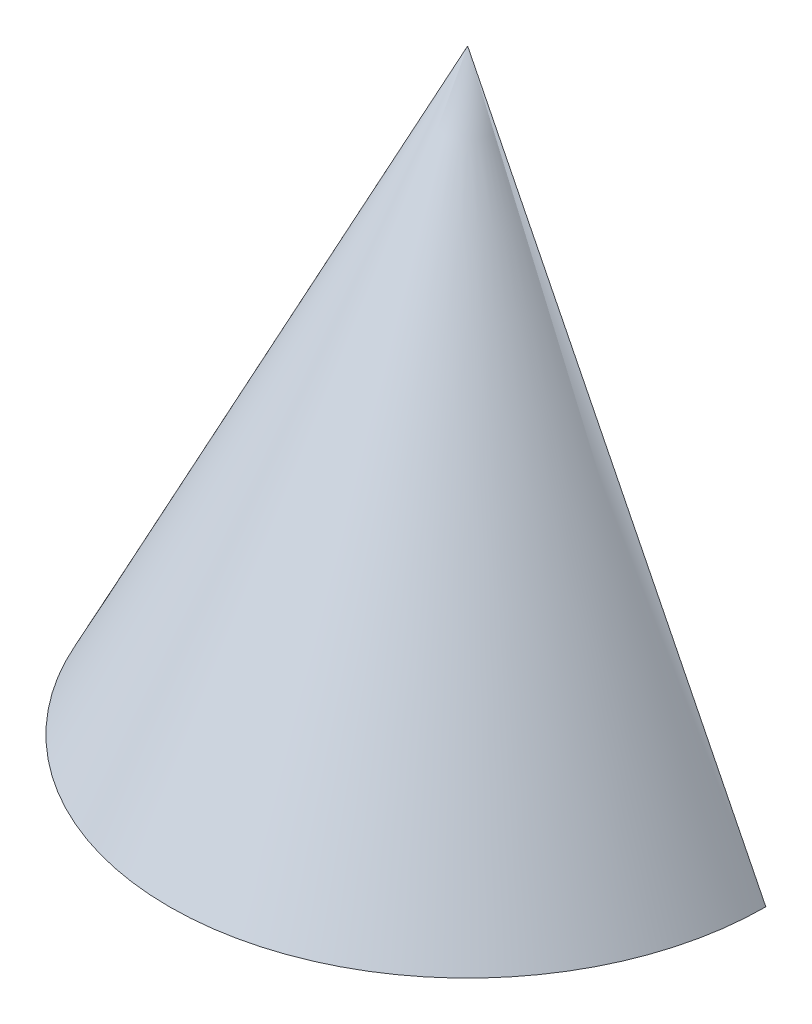
ISO-10303-21;
HEADER;
FILE_DESCRIPTION(('STEP AP214'),'2;1');
FILE_NAME('part.step','',(''),(''),'','','');
FILE_SCHEMA(('AUTOMOTIVE_DESIGN { 1 0 10303 214 1 1 1 1 }'));
ENDSEC;
DATA;
#1=APPLICATION_CONTEXT('core data for automotive mechanical design processes');
#2=APPLICATION_PROTOCOL_DEFINITION('international standard','automotive_design',2000,#1);
#3=PRODUCT_CONTEXT('',#1,'mechanical');
#4=PRODUCT('Part','Part','',(#3));
#5=PRODUCT_RELATED_PRODUCT_CATEGORY('part','',(#4));
#6=PRODUCT_DEFINITION_FORMATION('','',#4);
#7=PRODUCT_DEFINITION_CONTEXT('part definition',#1,'design');
#8=PRODUCT_DEFINITION('design','',#6,#7);
#9=PRODUCT_DEFINITION_SHAPE('','',#8);
#10=(LENGTH_UNIT() NAMED_UNIT(*) SI_UNIT(.MILLI.,.METRE.));
#11=(NAMED_UNIT(*) PLANE_ANGLE_UNIT() SI_UNIT($,.RADIAN.));
#12=(NAMED_UNIT(*) SI_UNIT($,.STERADIAN.) SOLID_ANGLE_UNIT());
#13=UNCERTAINTY_MEASURE_WITH_UNIT(LENGTH_MEASURE(1.E-05),#10,'distance_accuracy_value','');
#14=(GEOMETRIC_REPRESENTATION_CONTEXT(3) GLOBAL_UNCERTAINTY_ASSIGNED_CONTEXT((#13)) GLOBAL_UNIT_ASSIGNED_CONTEXT((#10,
#11,#12)) REPRESENTATION_CONTEXT('',''));
#15=CARTESIAN_POINT('',(0.,0.,0.));
#16=DIRECTION('',(0.,0.,1.));
#17=DIRECTION('',(1.,0.,0.));
#18=AXIS2_PLACEMENT_3D('',#15,#16,#17);
#19=CARTESIAN_POINT('',(0.,85.,0.));
#20=DIRECTION('',(0.,-1.,0.));
#21=DIRECTION('',(0.,0.,-1.));
#22=AXIS2_PLACEMENT_3D('',#19,#20,#21);
#23=CONICAL_SURFACE('',#22,0.,0.463733982254898);
#24=DIRECTION('',(0.447290848418715,-0.894388560370081,0.));
#25=VECTOR('',#24,1.);
#26=CARTESIAN_POINT('',(0.,85.,0.));
#27=LINE('',#26,#25);
#28=CARTESIAN_POINT('',(31.2567482019248,22.5,2.18264706119878E-13));
#29=VERTEX_POINT('',#28);
#30=CARTESIAN_POINT('',(0.,85.,0.));
#31=VERTEX_POINT('',#30);
#32=EDGE_CURVE('E59',#29,#31,#27,.F.);
#33=ORIENTED_EDGE('',*,*,#32,.F.);
#34=CARTESIAN_POINT('',(0.,22.5,0.));
#35=DIRECTION('',(0.,-1.,0.));
#36=DIRECTION('',(0.,0.,-1.));
#37=AXIS2_PLACEMENT_3D('',#34,#35,#36);
#38=CIRCLE('',#37,31.2567482019248);
#39=CARTESIAN_POINT('',(-31.2567482019248,22.5,-2.18264706119878E-13));
#40=VERTEX_POINT('',#39);
#41=EDGE_CURVE('E53',#29,#40,#38,.T.);
#42=ORIENTED_EDGE('',*,*,#41,.T.);
#43=DIRECTION('',(0.447290848418715,0.894388560370081,0.));
#44=VECTOR('',#43,1.);
#45=CARTESIAN_POINT('',(0.,85.,0.));
#46=LINE('',#45,#44);
#47=EDGE_CURVE('E106',#31,#40,#46,.F.);
#48=ORIENTED_EDGE('',*,*,#47,.F.);
#49=EDGE_LOOP('',(#33,#42,#48));
#50=FACE_BOUND('',#49,.T.);
#51=ADVANCED_FACE('F39',(#50),#23,.F.);
#52=CARTESIAN_POINT('',(0.,20.,0.));
#53=DIRECTION('',(0.,-1.,0.));
#54=DIRECTION('',(0.,0.,-1.));
#55=AXIS2_PLACEMENT_3D('',#52,#53,#54);
#56=CIRCLE('',#55,32.5070181300018);
#57=CARTESIAN_POINT('',(32.5070181300018,20.,2.26995294364673E-13));
#58=VERTEX_POINT('',#57);
#59=CARTESIAN_POINT('',(-32.5070181300018,20.,0.));
#60=VERTEX_POINT('',#59);
#61=EDGE_CURVE('E98',#58,#60,#56,.T.);
#62=ORIENTED_EDGE('',*,*,#61,.F.);
#63=CARTESIAN_POINT('',(36.2578279142328,12.5,2.53187059099059E-13));
#64=VERTEX_POINT('',#63);
#65=EDGE_CURVE('E116',#64,#58,#27,.F.);
#66=ORIENTED_EDGE('',*,*,#65,.F.);
#67=CARTESIAN_POINT('',(0.,12.5,0.));
#68=DIRECTION('',(0.,-1.,0.));
#69=DIRECTION('',(0.,0.,-1.));
#70=AXIS2_PLACEMENT_3D('',#67,#68,#69);
#71=CIRCLE('',#70,36.2578279142328);
#72=CARTESIAN_POINT('',(-36.2578279142328,12.5,-2.53187059099059E-13));
#73=VERTEX_POINT('',#72);
#74=EDGE_CURVE('E101',#64,#73,#71,.T.);
#75=ORIENTED_EDGE('',*,*,#74,.T.);
#76=EDGE_CURVE('E92',#60,#73,#46,.F.);
#77=ORIENTED_EDGE('',*,*,#76,.F.);
#78=EDGE_LOOP('',(#62,#66,#75,#77));
#79=FACE_BOUND('',#78,.T.);
#80=ADVANCED_FACE('F100',(#79),#23,.F.);
#81=CARTESIAN_POINT('',(0.,9.99999999999999,0.));
#82=DIRECTION('',(0.,-1.,0.));
#83=DIRECTION('',(0.,0.,-1.));
#84=AXIS2_PLACEMENT_3D('',#81,#82,#83);
#85=CIRCLE('',#84,37.5080978423098);
#86=CARTESIAN_POINT('',(37.5080978423098,10.,2.61917647343854E-13));
#87=VERTEX_POINT('',#86);
#88=CARTESIAN_POINT('',(-37.5080978423098,10.,0.));
#89=VERTEX_POINT('',#88);
#90=EDGE_CURVE('E127',#87,#89,#85,.T.);
#91=ORIENTED_EDGE('',*,*,#90,.F.);
#92=CARTESIAN_POINT('',(41.2589076265407,2.5,0.));
#93=VERTEX_POINT('',#92);
#94=EDGE_CURVE('E50',#93,#87,#27,.F.);
#95=ORIENTED_EDGE('',*,*,#94,.F.);
#96=CARTESIAN_POINT('',(0.,2.5,0.));
#97=DIRECTION('',(0.,-1.,0.));
#98=DIRECTION('',(0.,0.,-1.));
#99=AXIS2_PLACEMENT_3D('',#96,#97,#98);
#100=CIRCLE('',#99,41.2589076265407);
#101=CARTESIAN_POINT('',(-41.2589076265408,2.5,-2.88109412078239E-13));
#102=VERTEX_POINT('',#101);
#103=EDGE_CURVE('E11',#93,#102,#100,.T.);
#104=ORIENTED_EDGE('',*,*,#103,.T.);
#105=EDGE_CURVE('E110',#89,#102,#46,.F.);
#106=ORIENTED_EDGE('',*,*,#105,.F.);
#107=EDGE_LOOP('',(#91,#95,#104,#106));
#108=FACE_BOUND('',#107,.T.);
#109=ADVANCED_FACE('F151',(#108),#23,.F.);
#110=CARTESIAN_POINT('',(0.,0.,0.));
#111=DIRECTION('',(0.,0.,-1.));
#112=DIRECTION('',(-1.,0.,0.));
#113=AXIS2_PLACEMENT_3D('',#110,#111,#112);
#114=PLANE('',#113);
#115=DIRECTION('',(1.,0.,0.));
#116=VECTOR('',#115,1.);
#117=CARTESIAN_POINT('',(33.5,22.5,0.));
#118=LINE('',#117,#116);
#119=EDGE_CURVE('E114',#40,#29,#118,.T.);
#120=ORIENTED_EDGE('',*,*,#119,.T.);
#121=ORIENTED_EDGE('',*,*,#32,.T.);
#122=ORIENTED_EDGE('',*,*,#47,.T.);
#123=EDGE_LOOP('',(#120,#121,#122));
#124=FACE_BOUND('',#123,.T.);
#125=ORIENTED_EDGE('',*,*,#65,.T.);
#126=DIRECTION('',(1.,0.,0.));
#127=VECTOR('',#126,1.);
#128=CARTESIAN_POINT('',(33.5,20.,0.));
#129=LINE('',#128,#127);
#130=EDGE_CURVE('E115',#60,#58,#129,.T.);
#131=ORIENTED_EDGE('',*,*,#130,.F.);
#132=ORIENTED_EDGE('',*,*,#76,.T.);
#133=DIRECTION('',(1.,0.,0.));
#134=VECTOR('',#133,1.);
#135=CARTESIAN_POINT('',(38.2213365864859,12.5,0.));
#136=LINE('',#135,#134);
#137=EDGE_CURVE('E123',#73,#64,#136,.T.);
#138=ORIENTED_EDGE('',*,*,#137,.T.);
#139=EDGE_LOOP('',(#125,#131,#132,#138));
#140=FACE_BOUND('',#139,.T.);
#141=ORIENTED_EDGE('',*,*,#94,.T.);
#142=DIRECTION('',(1.,0.,0.));
#143=VECTOR('',#142,1.);
#144=CARTESIAN_POINT('',(38.2213365864859,10.,0.));
#145=LINE('',#144,#143);
#146=EDGE_CURVE('E122',#89,#87,#145,.T.);
#147=ORIENTED_EDGE('',*,*,#146,.F.);
#148=ORIENTED_EDGE('',*,*,#105,.T.);
#149=DIRECTION('',(1.,0.,0.));
#150=VECTOR('',#149,1.);
#151=CARTESIAN_POINT('',(-42.5091775546177,2.5,0.));
#152=LINE('',#151,#150);
#153=EDGE_CURVE('E131',#102,#93,#152,.T.);
#154=ORIENTED_EDGE('',*,*,#153,.T.);
#155=EDGE_LOOP('',(#141,#147,#148,#154));
#156=FACE_BOUND('',#155,.T.);
#157=DIRECTION('',(-1.,0.,0.));
#158=VECTOR('',#157,1.);
#159=CARTESIAN_POINT('',(0.,0.,0.));
#160=LINE('',#159,#158);
#161=CARTESIAN_POINT('',(45.,0.,0.));
#162=VERTEX_POINT('',#161);
#163=CARTESIAN_POINT('',(-45.,0.,-3.14233320495882E-13));
#164=VERTEX_POINT('',#163);
#165=EDGE_CURVE('E140',#162,#164,#160,.T.);
#166=ORIENTED_EDGE('',*,*,#165,.T.);
#167=DIRECTION('',(0.447213595499958,0.894427190999916,0.));
#168=VECTOR('',#167,1.);
#169=CARTESIAN_POINT('',(-45.,0.,-3.14233320495882E-13));
#170=LINE('',#169,#168);
#171=CARTESIAN_POINT('',(0.,90.,0.));
#172=VERTEX_POINT('',#171);
#173=EDGE_CURVE('E138',#164,#172,#170,.T.);
#174=ORIENTED_EDGE('',*,*,#173,.T.);
#175=DIRECTION('',(-0.447213595499958,0.894427190999916,0.));
#176=VECTOR('',#175,1.);
#177=CARTESIAN_POINT('',(45.,0.,0.));
#178=LINE('',#177,#176);
#179=EDGE_CURVE('E132',#162,#172,#178,.T.);
#180=ORIENTED_EDGE('',*,*,#179,.F.);
#181=EDGE_LOOP('',(#166,#174,#180));
#182=FACE_BOUND('',#181,.T.);
#183=ADVANCED_FACE('F113',(#124,#140,#156,#182),#114,.T.);
#184=CARTESIAN_POINT('',(0.,0.,0.));
#185=DIRECTION('',(0.,1.,0.));
#186=DIRECTION('',(0.,0.,1.));
#187=AXIS2_PLACEMENT_3D('',#184,#185,#186);
#188=PLANE('',#187);
#189=CARTESIAN_POINT('',(0.,0.,0.));
#190=DIRECTION('',(0.,1.,0.));
#191=DIRECTION('',(0.,0.,1.));
#192=AXIS2_PLACEMENT_3D('',#189,#190,#191);
#193=CIRCLE('',#192,45.);
#194=EDGE_CURVE('E142',#164,#162,#193,.T.);
#195=ORIENTED_EDGE('',*,*,#194,.F.);
#196=ORIENTED_EDGE('',*,*,#165,.F.);
#197=EDGE_LOOP('',(#195,#196));
#198=FACE_BOUND('',#197,.T.);
#199=ADVANCED_FACE('F41',(#198),#188,.F.);
#200=CARTESIAN_POINT('',(0.,0.,0.));
#201=DIRECTION('',(0.,-1.,0.));
#202=DIRECTION('',(0.,0.,-1.));
#203=AXIS2_PLACEMENT_3D('',#200,#201,#202);
#204=CONICAL_SURFACE('',#203,45.,0.463647609000806);
#205=ORIENTED_EDGE('',*,*,#173,.F.);
#206=ORIENTED_EDGE('',*,*,#194,.T.);
#207=ORIENTED_EDGE('',*,*,#179,.T.);
#208=EDGE_LOOP('',(#205,#206,#207));
#209=FACE_BOUND('',#208,.T.);
#210=ADVANCED_FACE('F171',(#209),#204,.T.);
#211=CARTESIAN_POINT('',(0.,2.5,0.));
#212=DIRECTION('',(0.,-1.,0.));
#213=DIRECTION('',(0.,0.,-1.));
#214=AXIS2_PLACEMENT_3D('',#211,#212,#213);
#215=PLANE('',#214);
#216=ORIENTED_EDGE('',*,*,#103,.F.);
#217=ORIENTED_EDGE('',*,*,#153,.F.);
#218=EDGE_LOOP('',(#216,#217));
#219=FACE_BOUND('',#218,.T.);
#220=ADVANCED_FACE('F168',(#219),#215,.F.);
#221=CARTESIAN_POINT('',(0.,12.5,0.));
#222=DIRECTION('',(0.,-1.,0.));
#223=DIRECTION('',(0.,0.,-1.));
#224=AXIS2_PLACEMENT_3D('',#221,#222,#223);
#225=PLANE('',#224);
#226=ORIENTED_EDGE('',*,*,#74,.F.);
#227=ORIENTED_EDGE('',*,*,#137,.F.);
#228=EDGE_LOOP('',(#226,#227));
#229=FACE_BOUND('',#228,.T.);
#230=ADVANCED_FACE('F174',(#229),#225,.F.);
#231=CARTESIAN_POINT('',(0.,10.,0.));
#232=DIRECTION('',(0.,-1.,0.));
#233=DIRECTION('',(0.,0.,-1.));
#234=AXIS2_PLACEMENT_3D('',#231,#232,#233);
#235=PLANE('',#234);
#236=ORIENTED_EDGE('',*,*,#146,.T.);
#237=ORIENTED_EDGE('',*,*,#90,.T.);
#238=EDGE_LOOP('',(#236,#237));
#239=FACE_BOUND('',#238,.T.);
#240=ADVANCED_FACE('F167',(#239),#235,.T.);
#241=CARTESIAN_POINT('',(0.,22.5,0.));
#242=DIRECTION('',(0.,-1.,0.));
#243=DIRECTION('',(0.,0.,-1.));
#244=AXIS2_PLACEMENT_3D('',#241,#242,#243);
#245=PLANE('',#244);
#246=ORIENTED_EDGE('',*,*,#41,.F.);
#247=ORIENTED_EDGE('',*,*,#119,.F.);
#248=EDGE_LOOP('',(#246,#247));
#249=FACE_BOUND('',#248,.T.);
#250=ADVANCED_FACE('F182',(#249),#245,.F.);
#251=CARTESIAN_POINT('',(0.,20.,0.));
#252=DIRECTION('',(0.,-1.,0.));
#253=DIRECTION('',(0.,0.,-1.));
#254=AXIS2_PLACEMENT_3D('',#251,#252,#253);
#255=PLANE('',#254);
#256=ORIENTED_EDGE('',*,*,#130,.T.);
#257=ORIENTED_EDGE('',*,*,#61,.T.);
#258=EDGE_LOOP('',(#256,#257));
#259=FACE_BOUND('',#258,.T.);
#260=ADVANCED_FACE('F112',(#259),#255,.T.);
#261=CLOSED_SHELL('',(#51,#80,#109,#183,#199,#210,#220,#230,#240,#250,#260));
#262=MANIFOLD_SOLID_BREP('B2',#261);
#263=ADVANCED_BREP_SHAPE_REPRESENTATION('',(#18,#262),#14);
#264=SHAPE_DEFINITION_REPRESENTATION(#9,#263);
ENDSEC;
END-ISO-10303-21;
